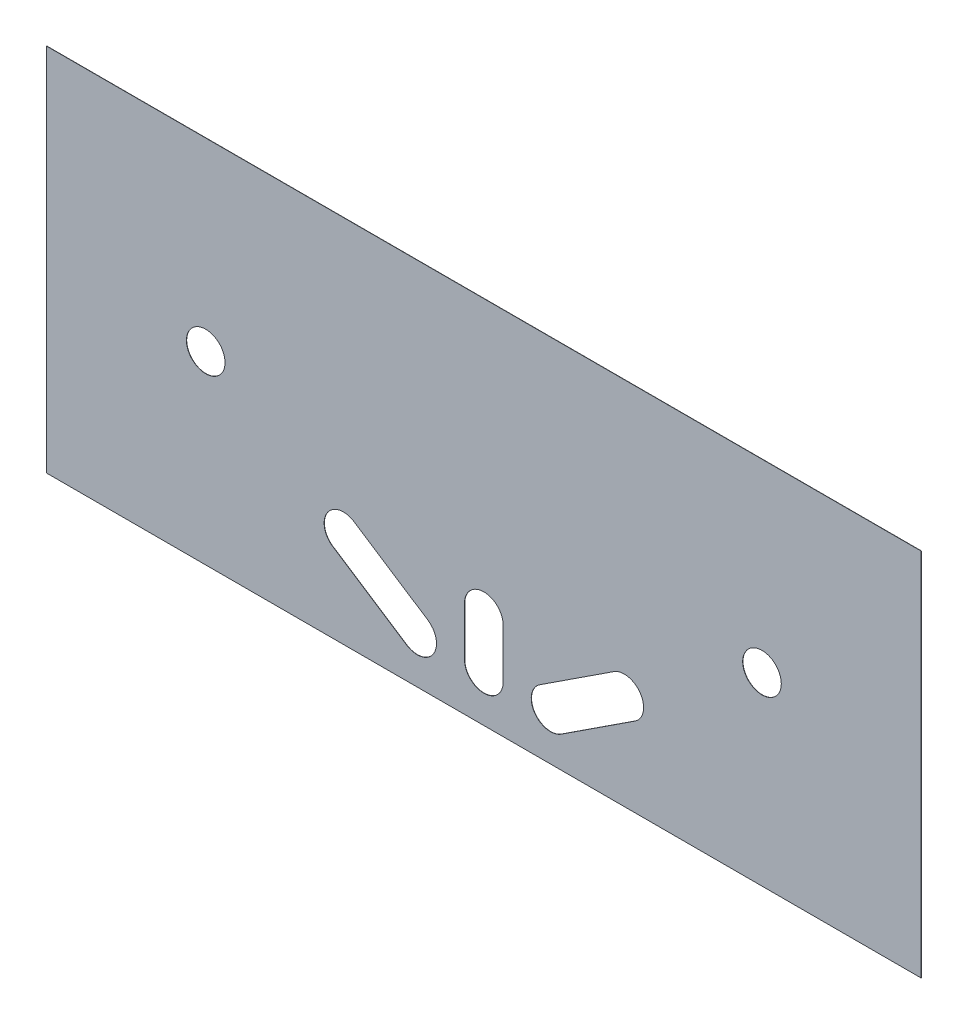
ISO-10303-21;
HEADER;
FILE_DESCRIPTION(('STEP AP214'),'2;1');
FILE_NAME('part.step','',(''),(''),'','','');
FILE_SCHEMA(('AUTOMOTIVE_DESIGN { 1 0 10303 214 1 1 1 1 }'));
ENDSEC;
DATA;
#1=APPLICATION_CONTEXT('core data for automotive mechanical design processes');
#2=APPLICATION_PROTOCOL_DEFINITION('international standard','automotive_design',2000,#1);
#3=PRODUCT_CONTEXT('',#1,'mechanical');
#4=PRODUCT('Part','Part','',(#3));
#5=PRODUCT_RELATED_PRODUCT_CATEGORY('part','',(#4));
#6=PRODUCT_DEFINITION_FORMATION('','',#4);
#7=PRODUCT_DEFINITION_CONTEXT('part definition',#1,'design');
#8=PRODUCT_DEFINITION('design','',#6,#7);
#9=PRODUCT_DEFINITION_SHAPE('','',#8);
#10=(LENGTH_UNIT() NAMED_UNIT(*) SI_UNIT(.MILLI.,.METRE.));
#11=(NAMED_UNIT(*) PLANE_ANGLE_UNIT() SI_UNIT($,.RADIAN.));
#12=(NAMED_UNIT(*) SI_UNIT($,.STERADIAN.) SOLID_ANGLE_UNIT());
#13=UNCERTAINTY_MEASURE_WITH_UNIT(LENGTH_MEASURE(1.E-05),#10,'distance_accuracy_value','');
#14=(GEOMETRIC_REPRESENTATION_CONTEXT(3) GLOBAL_UNCERTAINTY_ASSIGNED_CONTEXT((#13)) GLOBAL_UNIT_ASSIGNED_CONTEXT((#10,
#11,#12)) REPRESENTATION_CONTEXT('',''));
#15=CARTESIAN_POINT('',(0.,0.,0.));
#16=DIRECTION('',(0.,0.,1.));
#17=DIRECTION('',(1.,0.,0.));
#18=AXIS2_PLACEMENT_3D('',#15,#16,#17);
#19=CARTESIAN_POINT('',(-17.,-7.18811045522257,0.01));
#20=DIRECTION('',(1.,0.,0.));
#21=DIRECTION('',(0.,0.,-1.));
#22=AXIS2_PLACEMENT_3D('',#19,#20,#21);
#23=PLANE('',#22);
#24=DIRECTION('',(0.,-1.,0.));
#25=VECTOR('',#24,1.);
#26=CARTESIAN_POINT('',(-17.,-7.18811045522257,0.));
#27=LINE('',#26,#25);
#28=CARTESIAN_POINT('',(-17.,7.18811045522257,0.));
#29=VERTEX_POINT('',#28);
#30=CARTESIAN_POINT('',(-17.,-7.18811045522257,0.));
#31=VERTEX_POINT('',#30);
#32=EDGE_CURVE('E190',#29,#31,#27,.T.);
#33=ORIENTED_EDGE('',*,*,#32,.T.);
#34=DIRECTION('',(0.,0.,-1.));
#35=VECTOR('',#34,1.);
#36=CARTESIAN_POINT('',(-17.,-7.18811045522257,0.01));
#37=LINE('',#36,#35);
#38=CARTESIAN_POINT('',(-17.,-7.18811045522257,0.01));
#39=VERTEX_POINT('',#38);
#40=EDGE_CURVE('E11',#39,#31,#37,.T.);
#41=ORIENTED_EDGE('',*,*,#40,.F.);
#42=DIRECTION('',(0.,-1.,0.));
#43=VECTOR('',#42,1.);
#44=CARTESIAN_POINT('',(-17.,-7.18811045522257,0.01));
#45=LINE('',#44,#43);
#46=CARTESIAN_POINT('',(-17.,7.18811045522257,0.01));
#47=VERTEX_POINT('',#46);
#48=EDGE_CURVE('E196',#47,#39,#45,.T.);
#49=ORIENTED_EDGE('',*,*,#48,.F.);
#50=DIRECTION('',(0.,0.,-1.));
#51=VECTOR('',#50,1.);
#52=CARTESIAN_POINT('',(-17.,7.18811045522257,0.01));
#53=LINE('',#52,#51);
#54=EDGE_CURVE('E212',#47,#29,#53,.T.);
#55=ORIENTED_EDGE('',*,*,#54,.T.);
#56=EDGE_LOOP('',(#33,#41,#49,#55));
#57=FACE_BOUND('',#56,.T.);
#58=ADVANCED_FACE('F36',(#57),#23,.F.);
#59=CARTESIAN_POINT('',(17.,-7.18811045522257,0.01));
#60=DIRECTION('',(0.,1.,0.));
#61=DIRECTION('',(0.,0.,1.));
#62=AXIS2_PLACEMENT_3D('',#59,#60,#61);
#63=PLANE('',#62);
#64=DIRECTION('',(1.,0.,0.));
#65=VECTOR('',#64,1.);
#66=CARTESIAN_POINT('',(17.,-7.18811045522257,0.));
#67=LINE('',#66,#65);
#68=CARTESIAN_POINT('',(17.,-7.18811045522257,0.));
#69=VERTEX_POINT('',#68);
#70=EDGE_CURVE('E91',#31,#69,#67,.T.);
#71=ORIENTED_EDGE('',*,*,#70,.T.);
#72=DIRECTION('',(0.,0.,-1.));
#73=VECTOR('',#72,1.);
#74=CARTESIAN_POINT('',(17.,-7.18811045522257,0.01));
#75=LINE('',#74,#73);
#76=CARTESIAN_POINT('',(17.,-7.18811045522257,0.01));
#77=VERTEX_POINT('',#76);
#78=EDGE_CURVE('E45',#77,#69,#75,.T.);
#79=ORIENTED_EDGE('',*,*,#78,.F.);
#80=DIRECTION('',(1.,0.,0.));
#81=VECTOR('',#80,1.);
#82=CARTESIAN_POINT('',(17.,-7.18811045522257,0.01));
#83=LINE('',#82,#81);
#84=EDGE_CURVE('E200',#39,#77,#83,.T.);
#85=ORIENTED_EDGE('',*,*,#84,.F.);
#86=ORIENTED_EDGE('',*,*,#40,.T.);
#87=EDGE_LOOP('',(#71,#79,#85,#86));
#88=FACE_BOUND('',#87,.T.);
#89=ADVANCED_FACE('F329',(#88),#63,.F.);
#90=CARTESIAN_POINT('',(17.,-7.18811045522257,0.01));
#91=DIRECTION('',(-1.,0.,0.));
#92=DIRECTION('',(0.,0.,1.));
#93=AXIS2_PLACEMENT_3D('',#90,#91,#92);
#94=PLANE('',#93);
#95=DIRECTION('',(0.,1.,0.));
#96=VECTOR('',#95,1.);
#97=CARTESIAN_POINT('',(17.,-7.18811045522257,0.));
#98=LINE('',#97,#96);
#99=CARTESIAN_POINT('',(17.,7.18811045522257,0.));
#100=VERTEX_POINT('',#99);
#101=EDGE_CURVE('E217',#69,#100,#98,.T.);
#102=ORIENTED_EDGE('',*,*,#101,.T.);
#103=DIRECTION('',(0.,0.,-1.));
#104=VECTOR('',#103,1.);
#105=CARTESIAN_POINT('',(17.,7.18811045522257,0.01));
#106=LINE('',#105,#104);
#107=CARTESIAN_POINT('',(17.,7.18811045522257,0.01));
#108=VERTEX_POINT('',#107);
#109=EDGE_CURVE('E225',#108,#100,#106,.T.);
#110=ORIENTED_EDGE('',*,*,#109,.F.);
#111=DIRECTION('',(0.,1.,0.));
#112=VECTOR('',#111,1.);
#113=CARTESIAN_POINT('',(17.,-7.18811045522257,0.01));
#114=LINE('',#113,#112);
#115=EDGE_CURVE('E204',#77,#108,#114,.T.);
#116=ORIENTED_EDGE('',*,*,#115,.F.);
#117=ORIENTED_EDGE('',*,*,#78,.T.);
#118=EDGE_LOOP('',(#102,#110,#116,#117));
#119=FACE_BOUND('',#118,.T.);
#120=ADVANCED_FACE('F332',(#119),#94,.F.);
#121=CARTESIAN_POINT('',(17.,7.18811045522257,0.01));
#122=DIRECTION('',(0.,-1.,0.));
#123=DIRECTION('',(1.,0.,0.));
#124=AXIS2_PLACEMENT_3D('',#121,#122,#123);
#125=PLANE('',#124);
#126=DIRECTION('',(-1.,0.,0.));
#127=VECTOR('',#126,1.);
#128=CARTESIAN_POINT('',(17.,7.18811045522257,0.));
#129=LINE('',#128,#127);
#130=EDGE_CURVE('E201',#100,#29,#129,.T.);
#131=ORIENTED_EDGE('',*,*,#130,.T.);
#132=ORIENTED_EDGE('',*,*,#54,.F.);
#133=DIRECTION('',(-1.,0.,0.));
#134=VECTOR('',#133,1.);
#135=CARTESIAN_POINT('',(17.,7.18811045522257,0.01));
#136=LINE('',#135,#134);
#137=EDGE_CURVE('E208',#108,#47,#136,.T.);
#138=ORIENTED_EDGE('',*,*,#137,.F.);
#139=ORIENTED_EDGE('',*,*,#109,.T.);
#140=EDGE_LOOP('',(#131,#132,#138,#139));
#141=FACE_BOUND('',#140,.T.);
#142=ADVANCED_FACE('F325',(#141),#125,.F.);
#143=CARTESIAN_POINT('',(0.,0.,0.01));
#144=DIRECTION('',(0.,0.,1.));
#145=DIRECTION('',(1.,0.,0.));
#146=AXIS2_PLACEMENT_3D('',#143,#144,#145);
#147=PLANE('',#146);
#148=CARTESIAN_POINT('',(-10.8134594351799,0.,0.01));
#149=DIRECTION('',(0.,0.,1.));
#150=DIRECTION('',(1.,0.,0.));
#151=AXIS2_PLACEMENT_3D('',#148,#149,#150);
#152=CIRCLE('',#151,0.75);
#153=CARTESIAN_POINT('',(-10.0634594351799,0.,0.01));
#154=VERTEX_POINT('',#153);
#155=EDGE_CURVE('E182',#154,#154,#152,.T.);
#156=ORIENTED_EDGE('',*,*,#155,.F.);
#157=EDGE_LOOP('',(#156));
#158=FACE_BOUND('',#157,.T.);
#159=CARTESIAN_POINT('',(10.8134594351799,0.,0.01));
#160=DIRECTION('',(0.,0.,1.));
#161=DIRECTION('',(1.,0.,0.));
#162=AXIS2_PLACEMENT_3D('',#159,#160,#161);
#163=CIRCLE('',#162,0.75);
#164=CARTESIAN_POINT('',(11.5634594351799,0.,0.01));
#165=VERTEX_POINT('',#164);
#166=EDGE_CURVE('E174',#165,#165,#163,.T.);
#167=ORIENTED_EDGE('',*,*,#166,.F.);
#168=EDGE_LOOP('',(#167));
#169=FACE_BOUND('',#168,.T.);
#170=CARTESIAN_POINT('',(-5.46,-3.4751,0.01));
#171=DIRECTION('',(0.,0.,1.));
#172=DIRECTION('',(1.,0.,0.));
#173=AXIS2_PLACEMENT_3D('',#170,#171,#172);
#174=CIRCLE('',#173,0.749999999999995);
#175=CARTESIAN_POINT('',(-5.0496812092913,-2.8472955001823,0.01));
#176=VERTEX_POINT('',#175);
#177=CARTESIAN_POINT('',(-5.8703187907087,-4.10290449981769,0.01));
#178=VERTEX_POINT('',#177);
#179=EDGE_CURVE('E39',#176,#178,#174,.T.);
#180=ORIENTED_EDGE('',*,*,#179,.F.);
#181=DIRECTION('',(-0.837072666423596,0.547091720944936,0.));
#182=VECTOR('',#181,1.);
#183=CARTESIAN_POINT('',(-5.0496812092913,-2.8472955001823,0.01));
#184=LINE('',#183,#182);
#185=CARTESIAN_POINT('',(-2.18100767212483,-4.72219550018231,0.01));
#186=VERTEX_POINT('',#185);
#187=EDGE_CURVE('E82',#186,#176,#184,.T.);
#188=ORIENTED_EDGE('',*,*,#187,.F.);
#189=CARTESIAN_POINT('',(-2.59132646283353,-5.35,0.01));
#190=DIRECTION('',(0.,0.,1.));
#191=DIRECTION('',(1.,0.,0.));
#192=AXIS2_PLACEMENT_3D('',#189,#190,#191);
#193=CIRCLE('',#192,0.749999999999997);
#194=CARTESIAN_POINT('',(-3.00164525354223,-5.97780449981769,0.01));
#195=VERTEX_POINT('',#194);
#196=EDGE_CURVE('E166',#195,#186,#193,.T.);
#197=ORIENTED_EDGE('',*,*,#196,.F.);
#198=DIRECTION('',(0.837072666423595,-0.547091720944937,0.));
#199=VECTOR('',#198,1.);
#200=CARTESIAN_POINT('',(-5.8703187907087,-4.10290449981769,0.01));
#201=LINE('',#200,#199);
#202=EDGE_CURVE('E161',#178,#195,#201,.T.);
#203=ORIENTED_EDGE('',*,*,#202,.F.);
#204=EDGE_LOOP('',(#180,#188,#197,#203));
#205=FACE_BOUND('',#204,.T.);
#206=CARTESIAN_POINT('',(5.46,-3.4751,0.01));
#207=DIRECTION('',(0.,0.,1.));
#208=DIRECTION('',(1.,0.,0.));
#209=AXIS2_PLACEMENT_3D('',#206,#207,#208);
#210=CIRCLE('',#209,0.749999999999996);
#211=CARTESIAN_POINT('',(5.8703187907087,-4.10290449981769,0.01));
#212=VERTEX_POINT('',#211);
#213=CARTESIAN_POINT('',(5.0496812092913,-2.8472955001823,0.01));
#214=VERTEX_POINT('',#213);
#215=EDGE_CURVE('E146',#212,#214,#210,.T.);
#216=ORIENTED_EDGE('',*,*,#215,.F.);
#217=DIRECTION('',(0.837072666423595,0.547091720944937,0.));
#218=VECTOR('',#217,1.);
#219=CARTESIAN_POINT('',(5.8703187907087,-4.10290449981769,0.01));
#220=LINE('',#219,#218);
#221=CARTESIAN_POINT('',(3.00164525354223,-5.97780449981769,0.01));
#222=VERTEX_POINT('',#221);
#223=EDGE_CURVE('E135',#222,#212,#220,.T.);
#224=ORIENTED_EDGE('',*,*,#223,.F.);
#225=CARTESIAN_POINT('',(2.59132646283353,-5.35,0.01));
#226=DIRECTION('',(0.,0.,1.));
#227=DIRECTION('',(1.,0.,0.));
#228=AXIS2_PLACEMENT_3D('',#225,#226,#227);
#229=CIRCLE('',#228,0.749999999999997);
#230=CARTESIAN_POINT('',(2.18100767212483,-4.72219550018231,0.01));
#231=VERTEX_POINT('',#230);
#232=EDGE_CURVE('E129',#231,#222,#229,.T.);
#233=ORIENTED_EDGE('',*,*,#232,.F.);
#234=DIRECTION('',(-0.837072666423596,-0.547091720944936,0.));
#235=VECTOR('',#234,1.);
#236=CARTESIAN_POINT('',(5.0496812092913,-2.8472955001823,0.01));
#237=LINE('',#236,#235);
#238=EDGE_CURVE('E159',#214,#231,#237,.T.);
#239=ORIENTED_EDGE('',*,*,#238,.F.);
#240=EDGE_LOOP('',(#216,#224,#233,#239));
#241=FACE_BOUND('',#240,.T.);
#242=CARTESIAN_POINT('',(0.,-5.35,0.01));
#243=DIRECTION('',(0.,0.,1.));
#244=DIRECTION('',(1.,0.,0.));
#245=AXIS2_PLACEMENT_3D('',#242,#243,#244);
#246=CIRCLE('',#245,0.74999999999999);
#247=CARTESIAN_POINT('',(-0.74999999999999,-5.35,0.01));
#248=VERTEX_POINT('',#247);
#249=CARTESIAN_POINT('',(0.74999999999999,-5.35,0.01));
#250=VERTEX_POINT('',#249);
#251=EDGE_CURVE('E239',#248,#250,#246,.T.);
#252=ORIENTED_EDGE('',*,*,#251,.F.);
#253=DIRECTION('',(0.,-1.,0.));
#254=VECTOR('',#253,1.);
#255=CARTESIAN_POINT('',(-0.74999999999999,-5.35,0.01));
#256=LINE('',#255,#254);
#257=CARTESIAN_POINT('',(-0.74999999999999,-3.43605,0.01));
#258=VERTEX_POINT('',#257);
#259=EDGE_CURVE('E237',#258,#248,#256,.T.);
#260=ORIENTED_EDGE('',*,*,#259,.F.);
#261=CARTESIAN_POINT('',(0.,-3.43605,0.01));
#262=DIRECTION('',(0.,0.,1.));
#263=DIRECTION('',(1.,0.,0.));
#264=AXIS2_PLACEMENT_3D('',#261,#262,#263);
#265=CIRCLE('',#264,0.74999999999999);
#266=CARTESIAN_POINT('',(0.74999999999999,-3.43605,0.01));
#267=VERTEX_POINT('',#266);
#268=EDGE_CURVE('E234',#267,#258,#265,.T.);
#269=ORIENTED_EDGE('',*,*,#268,.F.);
#270=DIRECTION('',(0.,1.,0.));
#271=VECTOR('',#270,1.);
#272=CARTESIAN_POINT('',(0.74999999999999,-5.35,0.01));
#273=LINE('',#272,#271);
#274=EDGE_CURVE('E231',#250,#267,#273,.T.);
#275=ORIENTED_EDGE('',*,*,#274,.F.);
#276=EDGE_LOOP('',(#252,#260,#269,#275));
#277=FACE_BOUND('',#276,.T.);
#278=ORIENTED_EDGE('',*,*,#48,.T.);
#279=ORIENTED_EDGE('',*,*,#84,.T.);
#280=ORIENTED_EDGE('',*,*,#115,.T.);
#281=ORIENTED_EDGE('',*,*,#137,.T.);
#282=EDGE_LOOP('',(#278,#279,#280,#281));
#283=FACE_BOUND('',#282,.T.);
#284=ADVANCED_FACE('F157',(#158,#169,#205,#241,#277,#283),#147,.T.);
#285=CARTESIAN_POINT('',(0.,0.,0.));
#286=DIRECTION('',(0.,0.,1.));
#287=DIRECTION('',(1.,0.,0.));
#288=AXIS2_PLACEMENT_3D('',#285,#286,#287);
#289=PLANE('',#288);
#290=CARTESIAN_POINT('',(-10.8134594351799,0.,0.));
#291=DIRECTION('',(0.,0.,1.));
#292=DIRECTION('',(1.,0.,0.));
#293=AXIS2_PLACEMENT_3D('',#290,#291,#292);
#294=CIRCLE('',#293,0.75);
#295=CARTESIAN_POINT('',(-10.0634594351799,0.,0.));
#296=VERTEX_POINT('',#295);
#297=EDGE_CURVE('E528',#296,#296,#294,.T.);
#298=ORIENTED_EDGE('',*,*,#297,.T.);
#299=EDGE_LOOP('',(#298));
#300=FACE_BOUND('',#299,.T.);
#301=CARTESIAN_POINT('',(10.8134594351799,0.,0.));
#302=DIRECTION('',(0.,0.,1.));
#303=DIRECTION('',(1.,0.,0.));
#304=AXIS2_PLACEMENT_3D('',#301,#302,#303);
#305=CIRCLE('',#304,0.75);
#306=CARTESIAN_POINT('',(11.5634594351799,0.,0.));
#307=VERTEX_POINT('',#306);
#308=EDGE_CURVE('E271',#307,#307,#305,.T.);
#309=ORIENTED_EDGE('',*,*,#308,.T.);
#310=EDGE_LOOP('',(#309));
#311=FACE_BOUND('',#310,.T.);
#312=DIRECTION('',(-0.837072666423596,0.547091720944936,0.));
#313=VECTOR('',#312,1.);
#314=CARTESIAN_POINT('',(-5.0496812092913,-2.8472955001823,0.));
#315=LINE('',#314,#313);
#316=CARTESIAN_POINT('',(-2.18100767212483,-4.72219550018231,0.));
#317=VERTEX_POINT('',#316);
#318=CARTESIAN_POINT('',(-5.0496812092913,-2.8472955001823,0.));
#319=VERTEX_POINT('',#318);
#320=EDGE_CURVE('E537',#317,#319,#315,.T.);
#321=ORIENTED_EDGE('',*,*,#320,.T.);
#322=CARTESIAN_POINT('',(-5.46,-3.4751,0.));
#323=DIRECTION('',(0.,0.,1.));
#324=DIRECTION('',(-1.,0.,0.));
#325=AXIS2_PLACEMENT_3D('',#322,#323,#324);
#326=CIRCLE('',#325,0.749999999999995);
#327=CARTESIAN_POINT('',(-5.8703187907087,-4.10290449981769,0.));
#328=VERTEX_POINT('',#327);
#329=EDGE_CURVE('E268',#319,#328,#326,.T.);
#330=ORIENTED_EDGE('',*,*,#329,.T.);
#331=DIRECTION('',(0.837072666423595,-0.547091720944937,0.));
#332=VECTOR('',#331,1.);
#333=CARTESIAN_POINT('',(-5.8703187907087,-4.10290449981769,0.));
#334=LINE('',#333,#332);
#335=CARTESIAN_POINT('',(-3.00164525354223,-5.97780449981769,0.));
#336=VERTEX_POINT('',#335);
#337=EDGE_CURVE('E270',#328,#336,#334,.T.);
#338=ORIENTED_EDGE('',*,*,#337,.T.);
#339=CARTESIAN_POINT('',(-2.59132646283353,-5.35,0.));
#340=DIRECTION('',(0.,0.,1.));
#341=DIRECTION('',(-1.,0.,0.));
#342=AXIS2_PLACEMENT_3D('',#339,#340,#341);
#343=CIRCLE('',#342,0.749999999999997);
#344=EDGE_CURVE('E546',#336,#317,#343,.T.);
#345=ORIENTED_EDGE('',*,*,#344,.T.);
#346=EDGE_LOOP('',(#321,#330,#338,#345));
#347=FACE_BOUND('',#346,.T.);
#348=DIRECTION('',(0.837072666423595,0.547091720944937,0.));
#349=VECTOR('',#348,1.);
#350=CARTESIAN_POINT('',(5.8703187907087,-4.10290449981769,0.));
#351=LINE('',#350,#349);
#352=CARTESIAN_POINT('',(3.00164525354223,-5.97780449981769,0.));
#353=VERTEX_POINT('',#352);
#354=CARTESIAN_POINT('',(5.8703187907087,-4.10290449981769,0.));
#355=VERTEX_POINT('',#354);
#356=EDGE_CURVE('E554',#353,#355,#351,.T.);
#357=ORIENTED_EDGE('',*,*,#356,.T.);
#358=CARTESIAN_POINT('',(5.46,-3.4751,0.));
#359=DIRECTION('',(0.,0.,1.));
#360=DIRECTION('',(1.,0.,0.));
#361=AXIS2_PLACEMENT_3D('',#358,#359,#360);
#362=CIRCLE('',#361,0.749999999999996);
#363=CARTESIAN_POINT('',(5.0496812092913,-2.8472955001823,0.));
#364=VERTEX_POINT('',#363);
#365=EDGE_CURVE('E152',#355,#364,#362,.T.);
#366=ORIENTED_EDGE('',*,*,#365,.T.);
#367=DIRECTION('',(-0.837072666423596,-0.547091720944936,0.));
#368=VECTOR('',#367,1.);
#369=CARTESIAN_POINT('',(5.0496812092913,-2.8472955001823,0.));
#370=LINE('',#369,#368);
#371=CARTESIAN_POINT('',(2.18100767212483,-4.72219550018231,0.));
#372=VERTEX_POINT('',#371);
#373=EDGE_CURVE('E563',#364,#372,#370,.T.);
#374=ORIENTED_EDGE('',*,*,#373,.T.);
#375=CARTESIAN_POINT('',(2.59132646283353,-5.35,0.));
#376=DIRECTION('',(0.,0.,1.));
#377=DIRECTION('',(1.,0.,0.));
#378=AXIS2_PLACEMENT_3D('',#375,#376,#377);
#379=CIRCLE('',#378,0.749999999999997);
#380=EDGE_CURVE('E559',#372,#353,#379,.T.);
#381=ORIENTED_EDGE('',*,*,#380,.T.);
#382=EDGE_LOOP('',(#357,#366,#374,#381));
#383=FACE_BOUND('',#382,.T.);
#384=DIRECTION('',(0.,-1.,0.));
#385=VECTOR('',#384,1.);
#386=CARTESIAN_POINT('',(-0.74999999999999,-5.35,0.));
#387=LINE('',#386,#385);
#388=CARTESIAN_POINT('',(-0.74999999999999,-3.43605,0.));
#389=VERTEX_POINT('',#388);
#390=CARTESIAN_POINT('',(-0.74999999999999,-5.35,0.));
#391=VERTEX_POINT('',#390);
#392=EDGE_CURVE('E277',#389,#391,#387,.T.);
#393=ORIENTED_EDGE('',*,*,#392,.T.);
#394=CARTESIAN_POINT('',(0.,-5.35,0.));
#395=DIRECTION('',(0.,0.,1.));
#396=DIRECTION('',(1.,0.,0.));
#397=AXIS2_PLACEMENT_3D('',#394,#395,#396);
#398=CIRCLE('',#397,0.74999999999999);
#399=CARTESIAN_POINT('',(0.74999999999999,-5.35,0.));
#400=VERTEX_POINT('',#399);
#401=EDGE_CURVE('E155',#391,#400,#398,.T.);
#402=ORIENTED_EDGE('',*,*,#401,.T.);
#403=DIRECTION('',(0.,1.,0.));
#404=VECTOR('',#403,1.);
#405=CARTESIAN_POINT('',(0.74999999999999,-5.35,0.));
#406=LINE('',#405,#404);
#407=CARTESIAN_POINT('',(0.74999999999999,-3.43605,0.));
#408=VERTEX_POINT('',#407);
#409=EDGE_CURVE('E260',#400,#408,#406,.T.);
#410=ORIENTED_EDGE('',*,*,#409,.T.);
#411=CARTESIAN_POINT('',(0.,-3.43605,0.));
#412=DIRECTION('',(0.,0.,1.));
#413=DIRECTION('',(1.,0.,0.));
#414=AXIS2_PLACEMENT_3D('',#411,#412,#413);
#415=CIRCLE('',#414,0.74999999999999);
#416=EDGE_CURVE('E262',#408,#389,#415,.T.);
#417=ORIENTED_EDGE('',*,*,#416,.T.);
#418=EDGE_LOOP('',(#393,#402,#410,#417));
#419=FACE_BOUND('',#418,.T.);
#420=ORIENTED_EDGE('',*,*,#32,.F.);
#421=ORIENTED_EDGE('',*,*,#130,.F.);
#422=ORIENTED_EDGE('',*,*,#101,.F.);
#423=ORIENTED_EDGE('',*,*,#70,.F.);
#424=EDGE_LOOP('',(#420,#421,#422,#423));
#425=FACE_BOUND('',#424,.T.);
#426=ADVANCED_FACE('F310',(#300,#311,#347,#383,#419,#425),#289,.F.);
#427=CARTESIAN_POINT('',(0.,-5.35,0.));
#428=DIRECTION('',(0.,0.,1.));
#429=DIRECTION('',(1.,0.,0.));
#430=AXIS2_PLACEMENT_3D('',#427,#428,#429);
#431=CYLINDRICAL_SURFACE('',#430,0.74999999999999);
#432=ORIENTED_EDGE('',*,*,#251,.T.);
#433=DIRECTION('',(0.,0.,1.));
#434=VECTOR('',#433,1.);
#435=CARTESIAN_POINT('',(0.74999999999999,-5.35,0.));
#436=LINE('',#435,#434);
#437=EDGE_CURVE('E255',#400,#250,#436,.T.);
#438=ORIENTED_EDGE('',*,*,#437,.F.);
#439=ORIENTED_EDGE('',*,*,#401,.F.);
#440=DIRECTION('',(0.,0.,1.));
#441=VECTOR('',#440,1.);
#442=CARTESIAN_POINT('',(-0.74999999999999,-5.35,0.));
#443=LINE('',#442,#441);
#444=EDGE_CURVE('E235',#391,#248,#443,.T.);
#445=ORIENTED_EDGE('',*,*,#444,.T.);
#446=EDGE_LOOP('',(#432,#438,#439,#445));
#447=FACE_BOUND('',#446,.T.);
#448=ADVANCED_FACE('F298',(#447),#431,.F.);
#449=CARTESIAN_POINT('',(-0.74999999999999,-5.35,0.));
#450=DIRECTION('',(-1.,0.,0.));
#451=DIRECTION('',(0.,-1.,0.));
#452=AXIS2_PLACEMENT_3D('',#449,#450,#451);
#453=PLANE('',#452);
#454=ORIENTED_EDGE('',*,*,#259,.T.);
#455=ORIENTED_EDGE('',*,*,#444,.F.);
#456=ORIENTED_EDGE('',*,*,#392,.F.);
#457=DIRECTION('',(0.,0.,1.));
#458=VECTOR('',#457,1.);
#459=CARTESIAN_POINT('',(-0.74999999999999,-3.43605,0.));
#460=LINE('',#459,#458);
#461=EDGE_CURVE('E254',#389,#258,#460,.T.);
#462=ORIENTED_EDGE('',*,*,#461,.T.);
#463=EDGE_LOOP('',(#454,#455,#456,#462));
#464=FACE_BOUND('',#463,.T.);
#465=ADVANCED_FACE('F308',(#464),#453,.F.);
#466=CARTESIAN_POINT('',(0.,-3.43605,0.));
#467=DIRECTION('',(0.,0.,1.));
#468=DIRECTION('',(1.,0.,0.));
#469=AXIS2_PLACEMENT_3D('',#466,#467,#468);
#470=CYLINDRICAL_SURFACE('',#469,0.74999999999999);
#471=ORIENTED_EDGE('',*,*,#268,.T.);
#472=ORIENTED_EDGE('',*,*,#461,.F.);
#473=ORIENTED_EDGE('',*,*,#416,.F.);
#474=DIRECTION('',(0.,0.,1.));
#475=VECTOR('',#474,1.);
#476=CARTESIAN_POINT('',(0.74999999999999,-3.43605,0.));
#477=LINE('',#476,#475);
#478=EDGE_CURVE('E193',#408,#267,#477,.T.);
#479=ORIENTED_EDGE('',*,*,#478,.T.);
#480=EDGE_LOOP('',(#471,#472,#473,#479));
#481=FACE_BOUND('',#480,.T.);
#482=ADVANCED_FACE('F305',(#481),#470,.F.);
#483=CARTESIAN_POINT('',(0.74999999999999,-5.35,0.));
#484=DIRECTION('',(1.,0.,0.));
#485=DIRECTION('',(0.,1.,0.));
#486=AXIS2_PLACEMENT_3D('',#483,#484,#485);
#487=PLANE('',#486);
#488=ORIENTED_EDGE('',*,*,#274,.T.);
#489=ORIENTED_EDGE('',*,*,#478,.F.);
#490=ORIENTED_EDGE('',*,*,#409,.F.);
#491=ORIENTED_EDGE('',*,*,#437,.T.);
#492=EDGE_LOOP('',(#488,#489,#490,#491));
#493=FACE_BOUND('',#492,.T.);
#494=ADVANCED_FACE('F291',(#493),#487,.F.);
#495=CARTESIAN_POINT('',(5.46,-3.4751,0.));
#496=DIRECTION('',(0.,0.,1.));
#497=DIRECTION('',(1.,0.,0.));
#498=AXIS2_PLACEMENT_3D('',#495,#496,#497);
#499=CYLINDRICAL_SURFACE('',#498,0.749999999999996);
#500=ORIENTED_EDGE('',*,*,#215,.T.);
#501=DIRECTION('',(0.,0.,1.));
#502=VECTOR('',#501,1.);
#503=CARTESIAN_POINT('',(5.0496812092913,-2.8472955001823,0.));
#504=LINE('',#503,#502);
#505=EDGE_CURVE('E62',#364,#214,#504,.T.);
#506=ORIENTED_EDGE('',*,*,#505,.F.);
#507=ORIENTED_EDGE('',*,*,#365,.F.);
#508=DIRECTION('',(0.,0.,1.));
#509=VECTOR('',#508,1.);
#510=CARTESIAN_POINT('',(5.8703187907087,-4.10290449981769,0.));
#511=LINE('',#510,#509);
#512=EDGE_CURVE('E140',#355,#212,#511,.T.);
#513=ORIENTED_EDGE('',*,*,#512,.T.);
#514=EDGE_LOOP('',(#500,#506,#507,#513));
#515=FACE_BOUND('',#514,.T.);
#516=ADVANCED_FACE('F149',(#515),#499,.F.);
#517=CARTESIAN_POINT('',(5.8703187907087,-4.10290449981769,0.));
#518=DIRECTION('',(0.547091720944937,-0.837072666423595,0.));
#519=DIRECTION('',(0.837072666423595,0.547091720944937,0.));
#520=AXIS2_PLACEMENT_3D('',#517,#518,#519);
#521=PLANE('',#520);
#522=ORIENTED_EDGE('',*,*,#223,.T.);
#523=ORIENTED_EDGE('',*,*,#512,.F.);
#524=ORIENTED_EDGE('',*,*,#356,.F.);
#525=DIRECTION('',(0.,0.,1.));
#526=VECTOR('',#525,1.);
#527=CARTESIAN_POINT('',(3.00164525354223,-5.97780449981769,0.));
#528=LINE('',#527,#526);
#529=EDGE_CURVE('E142',#353,#222,#528,.T.);
#530=ORIENTED_EDGE('',*,*,#529,.T.);
#531=EDGE_LOOP('',(#522,#523,#524,#530));
#532=FACE_BOUND('',#531,.T.);
#533=ADVANCED_FACE('F137',(#532),#521,.F.);
#534=CARTESIAN_POINT('',(2.59132646283353,-5.35,0.));
#535=DIRECTION('',(0.,0.,1.));
#536=DIRECTION('',(1.,0.,0.));
#537=AXIS2_PLACEMENT_3D('',#534,#535,#536);
#538=CYLINDRICAL_SURFACE('',#537,0.749999999999997);
#539=ORIENTED_EDGE('',*,*,#232,.T.);
#540=ORIENTED_EDGE('',*,*,#529,.F.);
#541=ORIENTED_EDGE('',*,*,#380,.F.);
#542=DIRECTION('',(0.,0.,1.));
#543=VECTOR('',#542,1.);
#544=CARTESIAN_POINT('',(2.18100767212483,-4.72219550018231,0.));
#545=LINE('',#544,#543);
#546=EDGE_CURVE('E257',#372,#231,#545,.T.);
#547=ORIENTED_EDGE('',*,*,#546,.T.);
#548=EDGE_LOOP('',(#539,#540,#541,#547));
#549=FACE_BOUND('',#548,.T.);
#550=ADVANCED_FACE('F405',(#549),#538,.F.);
#551=CARTESIAN_POINT('',(5.0496812092913,-2.8472955001823,0.));
#552=DIRECTION('',(-0.547091720944936,0.837072666423595,0.));
#553=DIRECTION('',(-0.837072666423596,-0.547091720944936,0.));
#554=AXIS2_PLACEMENT_3D('',#551,#552,#553);
#555=PLANE('',#554);
#556=ORIENTED_EDGE('',*,*,#238,.T.);
#557=ORIENTED_EDGE('',*,*,#546,.F.);
#558=ORIENTED_EDGE('',*,*,#373,.F.);
#559=ORIENTED_EDGE('',*,*,#505,.T.);
#560=EDGE_LOOP('',(#556,#557,#558,#559));
#561=FACE_BOUND('',#560,.T.);
#562=ADVANCED_FACE('F413',(#561),#555,.F.);
#563=CARTESIAN_POINT('',(-5.46,-3.4751,0.));
#564=DIRECTION('',(0.,0.,1.));
#565=DIRECTION('',(1.,0.,0.));
#566=AXIS2_PLACEMENT_3D('',#563,#564,#565);
#567=CYLINDRICAL_SURFACE('',#566,0.749999999999995);
#568=ORIENTED_EDGE('',*,*,#179,.T.);
#569=DIRECTION('',(0.,0.,1.));
#570=VECTOR('',#569,1.);
#571=CARTESIAN_POINT('',(-5.8703187907087,-4.10290449981769,0.));
#572=LINE('',#571,#570);
#573=EDGE_CURVE('E53',#328,#178,#572,.T.);
#574=ORIENTED_EDGE('',*,*,#573,.F.);
#575=ORIENTED_EDGE('',*,*,#329,.F.);
#576=DIRECTION('',(0.,0.,1.));
#577=VECTOR('',#576,1.);
#578=CARTESIAN_POINT('',(-5.0496812092913,-2.8472955001823,0.));
#579=LINE('',#578,#577);
#580=EDGE_CURVE('E538',#319,#176,#579,.T.);
#581=ORIENTED_EDGE('',*,*,#580,.T.);
#582=EDGE_LOOP('',(#568,#574,#575,#581));
#583=FACE_BOUND('',#582,.T.);
#584=ADVANCED_FACE('F421',(#583),#567,.F.);
#585=CARTESIAN_POINT('',(-5.0496812092913,-2.8472955001823,0.));
#586=DIRECTION('',(0.547091720944936,0.837072666423596,0.));
#587=DIRECTION('',(-0.837072666423596,0.547091720944936,0.));
#588=AXIS2_PLACEMENT_3D('',#585,#586,#587);
#589=PLANE('',#588);
#590=ORIENTED_EDGE('',*,*,#187,.T.);
#591=ORIENTED_EDGE('',*,*,#580,.F.);
#592=ORIENTED_EDGE('',*,*,#320,.F.);
#593=DIRECTION('',(0.,0.,1.));
#594=VECTOR('',#593,1.);
#595=CARTESIAN_POINT('',(-2.18100767212483,-4.72219550018231,0.));
#596=LINE('',#595,#594);
#597=EDGE_CURVE('E251',#317,#186,#596,.T.);
#598=ORIENTED_EDGE('',*,*,#597,.T.);
#599=EDGE_LOOP('',(#590,#591,#592,#598));
#600=FACE_BOUND('',#599,.T.);
#601=ADVANCED_FACE('F429',(#600),#589,.F.);
#602=CARTESIAN_POINT('',(-2.59132646283353,-5.35,0.));
#603=DIRECTION('',(0.,0.,1.));
#604=DIRECTION('',(1.,0.,0.));
#605=AXIS2_PLACEMENT_3D('',#602,#603,#604);
#606=CYLINDRICAL_SURFACE('',#605,0.749999999999997);
#607=ORIENTED_EDGE('',*,*,#196,.T.);
#608=ORIENTED_EDGE('',*,*,#597,.F.);
#609=ORIENTED_EDGE('',*,*,#344,.F.);
#610=DIRECTION('',(0.,0.,1.));
#611=VECTOR('',#610,1.);
#612=CARTESIAN_POINT('',(-3.00164525354223,-5.97780449981769,0.));
#613=LINE('',#612,#611);
#614=EDGE_CURVE('E248',#336,#195,#613,.T.);
#615=ORIENTED_EDGE('',*,*,#614,.T.);
#616=EDGE_LOOP('',(#607,#608,#609,#615));
#617=FACE_BOUND('',#616,.T.);
#618=ADVANCED_FACE('F437',(#617),#606,.F.);
#619=CARTESIAN_POINT('',(-5.8703187907087,-4.10290449981769,0.));
#620=DIRECTION('',(-0.547091720944937,-0.837072666423595,0.));
#621=DIRECTION('',(0.837072666423595,-0.547091720944937,0.));
#622=AXIS2_PLACEMENT_3D('',#619,#620,#621);
#623=PLANE('',#622);
#624=ORIENTED_EDGE('',*,*,#202,.T.);
#625=ORIENTED_EDGE('',*,*,#614,.F.);
#626=ORIENTED_EDGE('',*,*,#337,.F.);
#627=ORIENTED_EDGE('',*,*,#573,.T.);
#628=EDGE_LOOP('',(#624,#625,#626,#627));
#629=FACE_BOUND('',#628,.T.);
#630=ADVANCED_FACE('F445',(#629),#623,.F.);
#631=CARTESIAN_POINT('',(10.8134594351799,0.,0.));
#632=DIRECTION('',(0.,0.,1.));
#633=DIRECTION('',(1.,0.,0.));
#634=AXIS2_PLACEMENT_3D('',#631,#632,#633);
#635=CYLINDRICAL_SURFACE('',#634,0.75);
#636=CARTESIAN_POINT('',(11.5634594351799,0.,0.01));
#637=CARTESIAN_POINT('',(11.5634594351799,0.,0.00989583333333333));
#638=CARTESIAN_POINT('',(11.5634594351799,0.,0.00979166666666667));
#639=CARTESIAN_POINT('',(11.5634594351799,0.,0.00958333333333333));
#640=CARTESIAN_POINT('',(11.5634594351799,0.,0.00947916666666667));
#641=CARTESIAN_POINT('',(11.5634594351799,0.,0.00927083333333333));
#642=CARTESIAN_POINT('',(11.5634594351799,0.,0.00916666666666667));
#643=CARTESIAN_POINT('',(11.5634594351799,0.,0.00895833333333333));
#644=CARTESIAN_POINT('',(11.5634594351799,0.,0.00885416666666667));
#645=CARTESIAN_POINT('',(11.5634594351799,0.,0.00864583333333334));
#646=CARTESIAN_POINT('',(11.5634594351799,0.,0.00854166666666667));
#647=CARTESIAN_POINT('',(11.5634594351799,0.,0.00833333333333333));
#648=CARTESIAN_POINT('',(11.5634594351799,0.,0.00822916666666667));
#649=CARTESIAN_POINT('',(11.5634594351799,0.,0.00802083333333333));
#650=CARTESIAN_POINT('',(11.5634594351799,0.,0.00791666666666667));
#651=CARTESIAN_POINT('',(11.5634594351799,0.,0.00770833333333333));
#652=CARTESIAN_POINT('',(11.5634594351799,0.,0.00760416666666667));
#653=CARTESIAN_POINT('',(11.5634594351799,0.,0.00739583333333333));
#654=CARTESIAN_POINT('',(11.5634594351799,0.,0.00729166666666667));
#655=CARTESIAN_POINT('',(11.5634594351799,0.,0.00708333333333333));
#656=CARTESIAN_POINT('',(11.5634594351799,0.,0.00697916666666667));
#657=CARTESIAN_POINT('',(11.5634594351799,0.,0.00677083333333333));
#658=CARTESIAN_POINT('',(11.5634594351799,0.,0.00666666666666667));
#659=CARTESIAN_POINT('',(11.5634594351799,0.,0.00645833333333333));
#660=CARTESIAN_POINT('',(11.5634594351799,0.,0.00635416666666667));
#661=CARTESIAN_POINT('',(11.5634594351799,0.,0.00614583333333333));
#662=CARTESIAN_POINT('',(11.5634594351799,0.,0.00604166666666667));
#663=CARTESIAN_POINT('',(11.5634594351799,0.,0.00583333333333333));
#664=CARTESIAN_POINT('',(11.5634594351799,0.,0.00572916666666667));
#665=CARTESIAN_POINT('',(11.5634594351799,0.,0.00552083333333333));
#666=CARTESIAN_POINT('',(11.5634594351799,0.,0.00541666666666667));
#667=CARTESIAN_POINT('',(11.5634594351799,0.,0.00520833333333333));
#668=CARTESIAN_POINT('',(11.5634594351799,0.,0.00510416666666667));
#669=CARTESIAN_POINT('',(11.5634594351799,0.,0.00489583333333333));
#670=CARTESIAN_POINT('',(11.5634594351799,0.,0.00479166666666667));
#671=CARTESIAN_POINT('',(11.5634594351799,0.,0.00458333333333333));
#672=CARTESIAN_POINT('',(11.5634594351799,0.,0.00447916666666667));
#673=CARTESIAN_POINT('',(11.5634594351799,0.,0.00427083333333333));
#674=CARTESIAN_POINT('',(11.5634594351799,0.,0.00416666666666667));
#675=CARTESIAN_POINT('',(11.5634594351799,0.,0.00395833333333333));
#676=CARTESIAN_POINT('',(11.5634594351799,0.,0.00385416666666667));
#677=CARTESIAN_POINT('',(11.5634594351799,0.,0.00364583333333333));
#678=CARTESIAN_POINT('',(11.5634594351799,0.,0.00354166666666667));
#679=CARTESIAN_POINT('',(11.5634594351799,0.,0.00333333333333333));
#680=CARTESIAN_POINT('',(11.5634594351799,0.,0.00322916666666667));
#681=CARTESIAN_POINT('',(11.5634594351799,0.,0.00302083333333333));
#682=CARTESIAN_POINT('',(11.5634594351799,0.,0.00291666666666667));
#683=CARTESIAN_POINT('',(11.5634594351799,0.,0.00270833333333333));
#684=CARTESIAN_POINT('',(11.5634594351799,0.,0.00260416666666667));
#685=CARTESIAN_POINT('',(11.5634594351799,0.,0.00239583333333333));
#686=CARTESIAN_POINT('',(11.5634594351799,0.,0.00229166666666667));
#687=CARTESIAN_POINT('',(11.5634594351799,0.,0.00208333333333333));
#688=CARTESIAN_POINT('',(11.5634594351799,0.,0.00197916666666667));
#689=CARTESIAN_POINT('',(11.5634594351799,0.,0.00177083333333333));
#690=CARTESIAN_POINT('',(11.5634594351799,0.,0.00166666666666667));
#691=CARTESIAN_POINT('',(11.5634594351799,0.,0.00145833333333333));
#692=CARTESIAN_POINT('',(11.5634594351799,0.,0.00135416666666667));
#693=CARTESIAN_POINT('',(11.5634594351799,0.,0.00114583333333333));
#694=CARTESIAN_POINT('',(11.5634594351799,0.,0.00104166666666667));
#695=CARTESIAN_POINT('',(11.5634594351799,0.,0.000833333333333334));
#696=CARTESIAN_POINT('',(11.5634594351799,0.,0.000729166666666667));
#697=CARTESIAN_POINT('',(11.5634594351799,0.,0.000520833333333334));
#698=CARTESIAN_POINT('',(11.5634594351799,0.,0.000416666666666667));
#699=CARTESIAN_POINT('',(11.5634594351799,0.,0.000208333333333334));
#700=CARTESIAN_POINT('',(11.5634594351799,0.,0.000104166666666667));
#701=CARTESIAN_POINT('',(11.5634594351799,0.,0.));
#702=B_SPLINE_CURVE_WITH_KNOTS('',3,(#636,#637,#638,#639,#640,#641,#642,#643,#644,#645,#646,
#647,#648,#649,#650,#651,#652,#653,#654,#655,#656,#657,#658,#659,#660,#661,#662,#663,#664,#665,
#666,#667,#668,#669,#670,#671,#672,#673,#674,#675,#676,#677,#678,#679,#680,#681,#682,#683,#684,
#685,#686,#687,#688,#689,#690,#691,#692,#693,#694,#695,#696,#697,#698,#699,#700,#701),
.UNSPECIFIED.,.F.,.F.,(4,2,2,2,2,2,2,2,2,2,2,2,2,2,2,2,2,2,2,2,2,2,2,2,2,2,2,2,2,2,2,2,4),(0.,
0.000312500000000001,0.000625,0.000937500000000001,0.00125,0.0015625,0.001875,0.0021875,0.0025,
0.0028125,0.003125,0.0034375,0.00375,0.0040625,0.004375,0.0046875,0.005,0.0053125,0.005625,
0.0059375,0.00625,0.0065625,0.006875,0.0071875,0.0075,0.0078125,0.008125,0.0084375,0.00875,
0.0090625,0.009375,0.0096875,0.01),.UNSPECIFIED.);
#703=EDGE_CURVE('BSEAM454',#165,#307,#702,.T.);
#704=ORIENTED_EDGE('',*,*,#166,.T.);
#705=ORIENTED_EDGE('',*,*,#308,.F.);
#706=ORIENTED_EDGE('',*,*,#703,.T.);
#707=ORIENTED_EDGE('',*,*,#703,.F.);
#708=EDGE_LOOP('',(#704,#706,#705,#707));
#709=FACE_BOUND('',#708,.T.);
#710=ADVANCED_FACE('F454',(#709),#635,.F.);
#711=CARTESIAN_POINT('',(-10.8134594351799,0.,0.));
#712=DIRECTION('',(0.,0.,1.));
#713=DIRECTION('',(1.,0.,0.));
#714=AXIS2_PLACEMENT_3D('',#711,#712,#713);
#715=CYLINDRICAL_SURFACE('',#714,0.75);
#716=CARTESIAN_POINT('',(-10.0634594351799,0.,0.01));
#717=CARTESIAN_POINT('',(-10.0634594351799,0.,0.00989583333333333));
#718=CARTESIAN_POINT('',(-10.0634594351799,0.,0.00979166666666667));
#719=CARTESIAN_POINT('',(-10.0634594351799,0.,0.00958333333333333));
#720=CARTESIAN_POINT('',(-10.0634594351799,0.,0.00947916666666667));
#721=CARTESIAN_POINT('',(-10.0634594351799,0.,0.00927083333333333));
#722=CARTESIAN_POINT('',(-10.0634594351799,0.,0.00916666666666667));
#723=CARTESIAN_POINT('',(-10.0634594351799,0.,0.00895833333333333));
#724=CARTESIAN_POINT('',(-10.0634594351799,0.,0.00885416666666667));
#725=CARTESIAN_POINT('',(-10.0634594351799,0.,0.00864583333333334));
#726=CARTESIAN_POINT('',(-10.0634594351799,0.,0.00854166666666667));
#727=CARTESIAN_POINT('',(-10.0634594351799,0.,0.00833333333333333));
#728=CARTESIAN_POINT('',(-10.0634594351799,0.,0.00822916666666667));
#729=CARTESIAN_POINT('',(-10.0634594351799,0.,0.00802083333333333));
#730=CARTESIAN_POINT('',(-10.0634594351799,0.,0.00791666666666667));
#731=CARTESIAN_POINT('',(-10.0634594351799,0.,0.00770833333333333));
#732=CARTESIAN_POINT('',(-10.0634594351799,0.,0.00760416666666667));
#733=CARTESIAN_POINT('',(-10.0634594351799,0.,0.00739583333333333));
#734=CARTESIAN_POINT('',(-10.0634594351799,0.,0.00729166666666667));
#735=CARTESIAN_POINT('',(-10.0634594351799,0.,0.00708333333333333));
#736=CARTESIAN_POINT('',(-10.0634594351799,0.,0.00697916666666667));
#737=CARTESIAN_POINT('',(-10.0634594351799,0.,0.00677083333333333));
#738=CARTESIAN_POINT('',(-10.0634594351799,0.,0.00666666666666667));
#739=CARTESIAN_POINT('',(-10.0634594351799,0.,0.00645833333333333));
#740=CARTESIAN_POINT('',(-10.0634594351799,0.,0.00635416666666667));
#741=CARTESIAN_POINT('',(-10.0634594351799,0.,0.00614583333333333));
#742=CARTESIAN_POINT('',(-10.0634594351799,0.,0.00604166666666667));
#743=CARTESIAN_POINT('',(-10.0634594351799,0.,0.00583333333333333));
#744=CARTESIAN_POINT('',(-10.0634594351799,0.,0.00572916666666667));
#745=CARTESIAN_POINT('',(-10.0634594351799,0.,0.00552083333333333));
#746=CARTESIAN_POINT('',(-10.0634594351799,0.,0.00541666666666667));
#747=CARTESIAN_POINT('',(-10.0634594351799,0.,0.00520833333333333));
#748=CARTESIAN_POINT('',(-10.0634594351799,0.,0.00510416666666667));
#749=CARTESIAN_POINT('',(-10.0634594351799,0.,0.00489583333333333));
#750=CARTESIAN_POINT('',(-10.0634594351799,0.,0.00479166666666667));
#751=CARTESIAN_POINT('',(-10.0634594351799,0.,0.00458333333333333));
#752=CARTESIAN_POINT('',(-10.0634594351799,0.,0.00447916666666667));
#753=CARTESIAN_POINT('',(-10.0634594351799,0.,0.00427083333333333));
#754=CARTESIAN_POINT('',(-10.0634594351799,0.,0.00416666666666667));
#755=CARTESIAN_POINT('',(-10.0634594351799,0.,0.00395833333333333));
#756=CARTESIAN_POINT('',(-10.0634594351799,0.,0.00385416666666667));
#757=CARTESIAN_POINT('',(-10.0634594351799,0.,0.00364583333333333));
#758=CARTESIAN_POINT('',(-10.0634594351799,0.,0.00354166666666667));
#759=CARTESIAN_POINT('',(-10.0634594351799,0.,0.00333333333333333));
#760=CARTESIAN_POINT('',(-10.0634594351799,0.,0.00322916666666667));
#761=CARTESIAN_POINT('',(-10.0634594351799,0.,0.00302083333333333));
#762=CARTESIAN_POINT('',(-10.0634594351799,0.,0.00291666666666667));
#763=CARTESIAN_POINT('',(-10.0634594351799,0.,0.00270833333333333));
#764=CARTESIAN_POINT('',(-10.0634594351799,0.,0.00260416666666667));
#765=CARTESIAN_POINT('',(-10.0634594351799,0.,0.00239583333333333));
#766=CARTESIAN_POINT('',(-10.0634594351799,0.,0.00229166666666667));
#767=CARTESIAN_POINT('',(-10.0634594351799,0.,0.00208333333333333));
#768=CARTESIAN_POINT('',(-10.0634594351799,0.,0.00197916666666667));
#769=CARTESIAN_POINT('',(-10.0634594351799,0.,0.00177083333333333));
#770=CARTESIAN_POINT('',(-10.0634594351799,0.,0.00166666666666667));
#771=CARTESIAN_POINT('',(-10.0634594351799,0.,0.00145833333333333));
#772=CARTESIAN_POINT('',(-10.0634594351799,0.,0.00135416666666667));
#773=CARTESIAN_POINT('',(-10.0634594351799,0.,0.00114583333333333));
#774=CARTESIAN_POINT('',(-10.0634594351799,0.,0.00104166666666667));
#775=CARTESIAN_POINT('',(-10.0634594351799,0.,0.000833333333333334));
#776=CARTESIAN_POINT('',(-10.0634594351799,0.,0.000729166666666667));
#777=CARTESIAN_POINT('',(-10.0634594351799,0.,0.000520833333333334));
#778=CARTESIAN_POINT('',(-10.0634594351799,0.,0.000416666666666667));
#779=CARTESIAN_POINT('',(-10.0634594351799,0.,0.000208333333333334));
#780=CARTESIAN_POINT('',(-10.0634594351799,0.,0.000104166666666667));
#781=CARTESIAN_POINT('',(-10.0634594351799,0.,0.));
#782=B_SPLINE_CURVE_WITH_KNOTS('',3,(#716,#717,#718,#719,#720,#721,#722,#723,#724,#725,#726,
#727,#728,#729,#730,#731,#732,#733,#734,#735,#736,#737,#738,#739,#740,#741,#742,#743,#744,#745,
#746,#747,#748,#749,#750,#751,#752,#753,#754,#755,#756,#757,#758,#759,#760,#761,#762,#763,#764,
#765,#766,#767,#768,#769,#770,#771,#772,#773,#774,#775,#776,#777,#778,#779,#780,#781),
.UNSPECIFIED.,.F.,.F.,(4,2,2,2,2,2,2,2,2,2,2,2,2,2,2,2,2,2,2,2,2,2,2,2,2,2,2,2,2,2,2,2,4),(0.,
0.000312500000000001,0.000625,0.000937500000000001,0.00125,0.0015625,0.001875,0.0021875,0.0025,
0.0028125,0.003125,0.0034375,0.00375,0.0040625,0.004375,0.0046875,0.005,0.0053125,0.005625,
0.0059375,0.00625,0.0065625,0.006875,0.0071875,0.0075,0.0078125,0.008125,0.0084375,0.00875,
0.0090625,0.009375,0.0096875,0.01),.UNSPECIFIED.);
#783=EDGE_CURVE('BSEAM462',#154,#296,#782,.T.);
#784=ORIENTED_EDGE('',*,*,#155,.T.);
#785=ORIENTED_EDGE('',*,*,#297,.F.);
#786=ORIENTED_EDGE('',*,*,#783,.T.);
#787=ORIENTED_EDGE('',*,*,#783,.F.);
#788=EDGE_LOOP('',(#784,#786,#785,#787));
#789=FACE_BOUND('',#788,.T.);
#790=ADVANCED_FACE('F462',(#789),#715,.F.);
#791=CLOSED_SHELL('',(#58,#89,#120,#142,#284,#426,#448,#465,#482,#494,#516,#533,#550,#562,#584,
#601,#618,#630,#710,#790));
#792=MANIFOLD_SOLID_BREP('B2',#791);
#793=ADVANCED_BREP_SHAPE_REPRESENTATION('',(#18,#792),#14);
#794=SHAPE_DEFINITION_REPRESENTATION(#9,#793);
ENDSEC;
END-ISO-10303-21;
